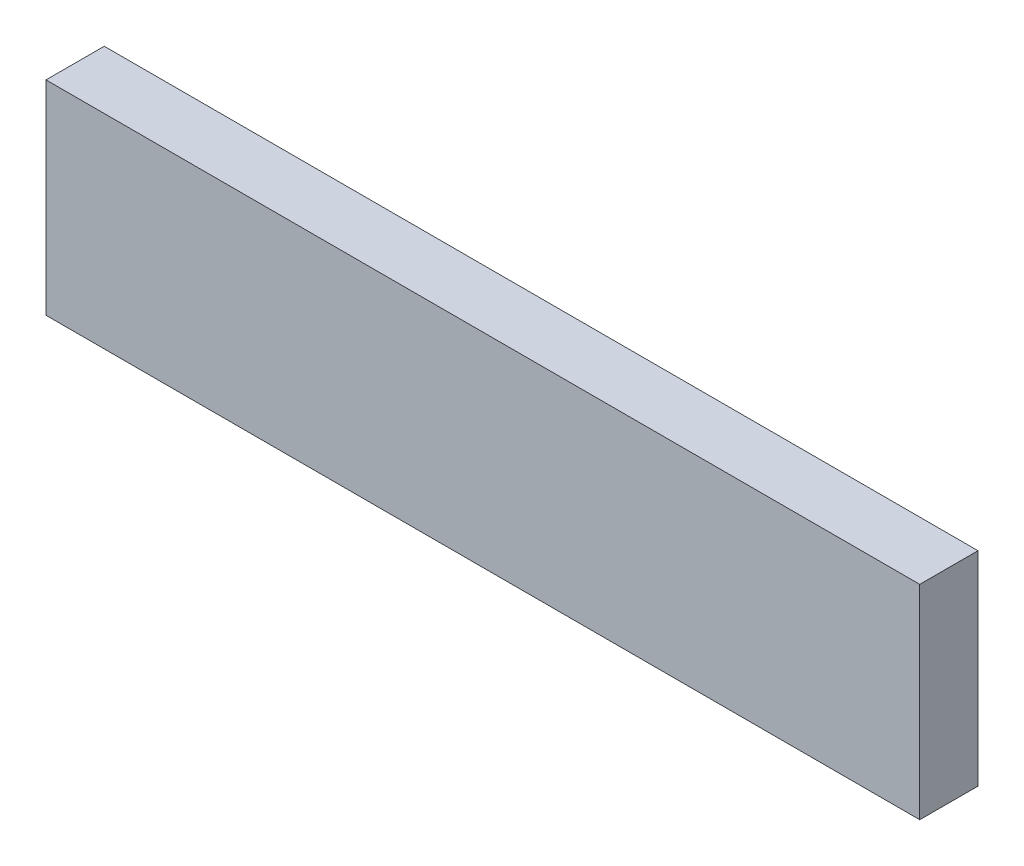
ISO-10303-21;
HEADER;
FILE_DESCRIPTION(('STEP AP214'),'2;1');
FILE_NAME('part.step','',(''),(''),'','','');
FILE_SCHEMA(('AUTOMOTIVE_DESIGN { 1 0 10303 214 1 1 1 1 }'));
ENDSEC;
DATA;
#1=APPLICATION_CONTEXT('core data for automotive mechanical design processes');
#2=APPLICATION_PROTOCOL_DEFINITION('international standard','automotive_design',2000,#1);
#3=PRODUCT_CONTEXT('',#1,'mechanical');
#4=PRODUCT('Part','Part','',(#3));
#5=PRODUCT_RELATED_PRODUCT_CATEGORY('part','',(#4));
#6=PRODUCT_DEFINITION_FORMATION('','',#4);
#7=PRODUCT_DEFINITION_CONTEXT('part definition',#1,'design');
#8=PRODUCT_DEFINITION('design','',#6,#7);
#9=PRODUCT_DEFINITION_SHAPE('','',#8);
#10=(LENGTH_UNIT() NAMED_UNIT(*) SI_UNIT(.MILLI.,.METRE.));
#11=(NAMED_UNIT(*) PLANE_ANGLE_UNIT() SI_UNIT($,.RADIAN.));
#12=(NAMED_UNIT(*) SI_UNIT($,.STERADIAN.) SOLID_ANGLE_UNIT());
#13=UNCERTAINTY_MEASURE_WITH_UNIT(LENGTH_MEASURE(1.E-05),#10,'distance_accuracy_value','');
#14=(GEOMETRIC_REPRESENTATION_CONTEXT(3) GLOBAL_UNCERTAINTY_ASSIGNED_CONTEXT((#13)) GLOBAL_UNIT_ASSIGNED_CONTEXT((#10,
#11,#12)) REPRESENTATION_CONTEXT('',''));
#15=CARTESIAN_POINT('',(0.,0.,0.));
#16=DIRECTION('',(0.,0.,1.));
#17=DIRECTION('',(1.,0.,0.));
#18=AXIS2_PLACEMENT_3D('',#15,#16,#17);
#19=CARTESIAN_POINT('',(150.,-35.,20.));
#20=DIRECTION('',(-1.,0.,0.));
#21=DIRECTION('',(0.,0.,1.));
#22=AXIS2_PLACEMENT_3D('',#19,#20,#21);
#23=PLANE('',#22);
#24=DIRECTION('',(0.,1.,0.));
#25=VECTOR('',#24,1.);
#26=CARTESIAN_POINT('',(150.,-35.,0.));
#27=LINE('',#26,#25);
#28=CARTESIAN_POINT('',(150.,-35.,0.));
#29=VERTEX_POINT('',#28);
#30=CARTESIAN_POINT('',(150.,35.,0.));
#31=VERTEX_POINT('',#30);
#32=EDGE_CURVE('E113',#29,#31,#27,.T.);
#33=ORIENTED_EDGE('',*,*,#32,.T.);
#34=DIRECTION('',(0.,0.,-1.));
#35=VECTOR('',#34,1.);
#36=CARTESIAN_POINT('',(150.,35.,20.));
#37=LINE('',#36,#35);
#38=CARTESIAN_POINT('',(150.,35.,20.));
#39=VERTEX_POINT('',#38);
#40=EDGE_CURVE('E11',#39,#31,#37,.T.);
#41=ORIENTED_EDGE('',*,*,#40,.F.);
#42=DIRECTION('',(0.,1.,0.));
#43=VECTOR('',#42,1.);
#44=CARTESIAN_POINT('',(150.,-35.,20.));
#45=LINE('',#44,#43);
#46=CARTESIAN_POINT('',(150.,-35.,20.));
#47=VERTEX_POINT('',#46);
#48=EDGE_CURVE('E97',#47,#39,#45,.T.);
#49=ORIENTED_EDGE('',*,*,#48,.F.);
#50=DIRECTION('',(0.,0.,-1.));
#51=VECTOR('',#50,1.);
#52=CARTESIAN_POINT('',(150.,-35.,20.));
#53=LINE('',#52,#51);
#54=EDGE_CURVE('E109',#47,#29,#53,.T.);
#55=ORIENTED_EDGE('',*,*,#54,.T.);
#56=EDGE_LOOP('',(#33,#41,#49,#55));
#57=FACE_BOUND('',#56,.T.);
#58=ADVANCED_FACE('F45',(#57),#23,.F.);
#59=CARTESIAN_POINT('',(-150.,35.,20.));
#60=DIRECTION('',(0.,-1.,0.));
#61=DIRECTION('',(0.,0.,-1.));
#62=AXIS2_PLACEMENT_3D('',#59,#60,#61);
#63=PLANE('',#62);
#64=DIRECTION('',(-1.,0.,0.));
#65=VECTOR('',#64,1.);
#66=CARTESIAN_POINT('',(-150.,35.,0.));
#67=LINE('',#66,#65);
#68=CARTESIAN_POINT('',(-150.,35.,0.));
#69=VERTEX_POINT('',#68);
#70=EDGE_CURVE('E102',#31,#69,#67,.T.);
#71=ORIENTED_EDGE('',*,*,#70,.T.);
#72=DIRECTION('',(0.,0.,-1.));
#73=VECTOR('',#72,1.);
#74=CARTESIAN_POINT('',(-150.,35.,20.));
#75=LINE('',#74,#73);
#76=CARTESIAN_POINT('',(-150.,35.,20.));
#77=VERTEX_POINT('',#76);
#78=EDGE_CURVE('E54',#77,#69,#75,.T.);
#79=ORIENTED_EDGE('',*,*,#78,.F.);
#80=DIRECTION('',(-1.,0.,0.));
#81=VECTOR('',#80,1.);
#82=CARTESIAN_POINT('',(-150.,35.,20.));
#83=LINE('',#82,#81);
#84=EDGE_CURVE('E92',#39,#77,#83,.T.);
#85=ORIENTED_EDGE('',*,*,#84,.F.);
#86=ORIENTED_EDGE('',*,*,#40,.T.);
#87=EDGE_LOOP('',(#71,#79,#85,#86));
#88=FACE_BOUND('',#87,.T.);
#89=ADVANCED_FACE('F101',(#88),#63,.F.);
#90=CARTESIAN_POINT('',(-150.,-35.,20.));
#91=DIRECTION('',(1.,0.,0.));
#92=DIRECTION('',(0.,0.,-1.));
#93=AXIS2_PLACEMENT_3D('',#90,#91,#92);
#94=PLANE('',#93);
#95=DIRECTION('',(0.,-1.,0.));
#96=VECTOR('',#95,1.);
#97=CARTESIAN_POINT('',(-150.,-35.,0.));
#98=LINE('',#97,#96);
#99=CARTESIAN_POINT('',(-150.,-35.,0.));
#100=VERTEX_POINT('',#99);
#101=EDGE_CURVE('E79',#69,#100,#98,.T.);
#102=ORIENTED_EDGE('',*,*,#101,.T.);
#103=DIRECTION('',(0.,0.,-1.));
#104=VECTOR('',#103,1.);
#105=CARTESIAN_POINT('',(-150.,-35.,20.));
#106=LINE('',#105,#104);
#107=CARTESIAN_POINT('',(-150.,-35.,20.));
#108=VERTEX_POINT('',#107);
#109=EDGE_CURVE('E104',#108,#100,#106,.T.);
#110=ORIENTED_EDGE('',*,*,#109,.F.);
#111=DIRECTION('',(0.,-1.,0.));
#112=VECTOR('',#111,1.);
#113=CARTESIAN_POINT('',(-150.,-35.,20.));
#114=LINE('',#113,#112);
#115=EDGE_CURVE('E95',#77,#108,#114,.T.);
#116=ORIENTED_EDGE('',*,*,#115,.F.);
#117=ORIENTED_EDGE('',*,*,#78,.T.);
#118=EDGE_LOOP('',(#102,#110,#116,#117));
#119=FACE_BOUND('',#118,.T.);
#120=ADVANCED_FACE('F105',(#119),#94,.F.);
#121=CARTESIAN_POINT('',(-150.,-35.,20.));
#122=DIRECTION('',(0.,1.,0.));
#123=DIRECTION('',(0.,0.,1.));
#124=AXIS2_PLACEMENT_3D('',#121,#122,#123);
#125=PLANE('',#124);
#126=DIRECTION('',(1.,0.,0.));
#127=VECTOR('',#126,1.);
#128=CARTESIAN_POINT('',(-150.,-35.,0.));
#129=LINE('',#128,#127);
#130=EDGE_CURVE('E85',#100,#29,#129,.T.);
#131=ORIENTED_EDGE('',*,*,#130,.T.);
#132=ORIENTED_EDGE('',*,*,#54,.F.);
#133=DIRECTION('',(1.,0.,0.));
#134=VECTOR('',#133,1.);
#135=CARTESIAN_POINT('',(-150.,-35.,20.));
#136=LINE('',#135,#134);
#137=EDGE_CURVE('E62',#108,#47,#136,.T.);
#138=ORIENTED_EDGE('',*,*,#137,.F.);
#139=ORIENTED_EDGE('',*,*,#109,.T.);
#140=EDGE_LOOP('',(#131,#132,#138,#139));
#141=FACE_BOUND('',#140,.T.);
#142=ADVANCED_FACE('F126',(#141),#125,.F.);
#143=CARTESIAN_POINT('',(0.,0.,20.));
#144=DIRECTION('',(0.,0.,-1.));
#145=DIRECTION('',(-1.,0.,0.));
#146=AXIS2_PLACEMENT_3D('',#143,#144,#145);
#147=PLANE('',#146);
#148=ORIENTED_EDGE('',*,*,#48,.T.);
#149=ORIENTED_EDGE('',*,*,#84,.T.);
#150=ORIENTED_EDGE('',*,*,#115,.T.);
#151=ORIENTED_EDGE('',*,*,#137,.T.);
#152=EDGE_LOOP('',(#148,#149,#150,#151));
#153=FACE_BOUND('',#152,.T.);
#154=ADVANCED_FACE('F93',(#153),#147,.F.);
#155=CARTESIAN_POINT('',(0.,0.,0.));
#156=DIRECTION('',(0.,0.,-1.));
#157=DIRECTION('',(-1.,0.,0.));
#158=AXIS2_PLACEMENT_3D('',#155,#156,#157);
#159=PLANE('',#158);
#160=ORIENTED_EDGE('',*,*,#32,.F.);
#161=ORIENTED_EDGE('',*,*,#130,.F.);
#162=ORIENTED_EDGE('',*,*,#101,.F.);
#163=ORIENTED_EDGE('',*,*,#70,.F.);
#164=EDGE_LOOP('',(#160,#161,#162,#163));
#165=FACE_BOUND('',#164,.T.);
#166=ADVANCED_FACE('F129',(#165),#159,.T.);
#167=CLOSED_SHELL('',(#58,#89,#120,#142,#154,#166));
#168=MANIFOLD_SOLID_BREP('B2',#167);
#169=ADVANCED_BREP_SHAPE_REPRESENTATION('',(#18,#168),#14);
#170=SHAPE_DEFINITION_REPRESENTATION(#9,#169);
ENDSEC;
END-ISO-10303-21;
